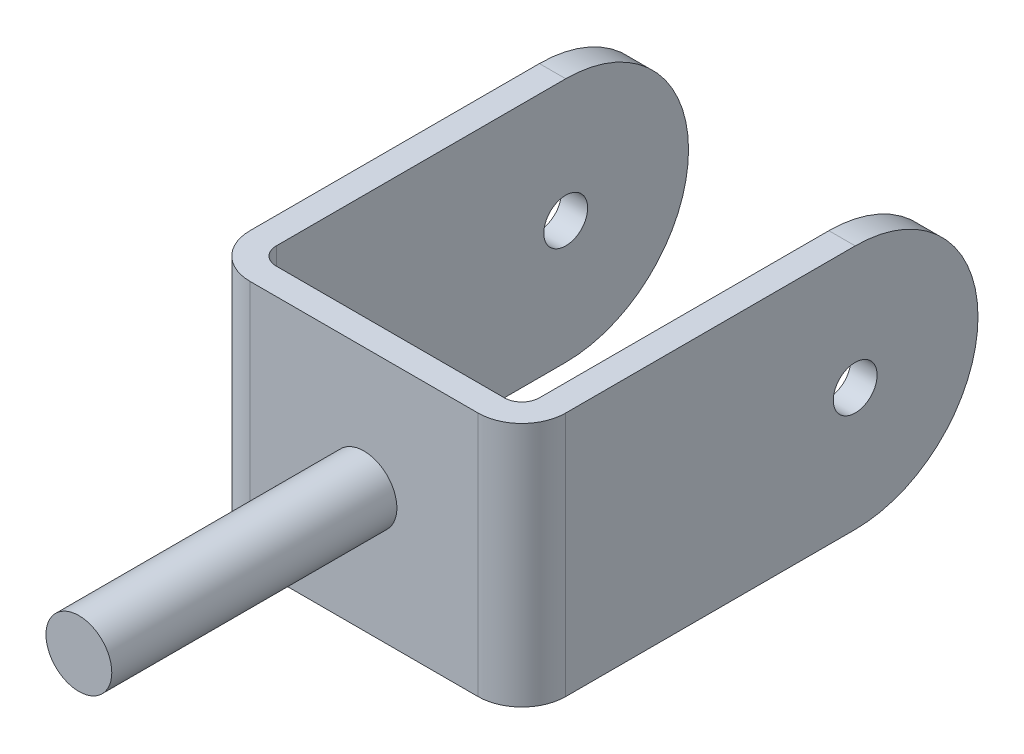
ISO-10303-21;
HEADER;
FILE_DESCRIPTION(('STEP AP214'),'2;1');
FILE_NAME('part.step','',(''),(''),'','','');
FILE_SCHEMA(('AUTOMOTIVE_DESIGN { 1 0 10303 214 1 1 1 1 }'));
ENDSEC;
DATA;
#1=APPLICATION_CONTEXT('core data for automotive mechanical design processes');
#2=APPLICATION_PROTOCOL_DEFINITION('international standard','automotive_design',2000,#1);
#3=PRODUCT_CONTEXT('',#1,'mechanical');
#4=PRODUCT('Part','Part','',(#3));
#5=PRODUCT_RELATED_PRODUCT_CATEGORY('part','',(#4));
#6=PRODUCT_DEFINITION_FORMATION('','',#4);
#7=PRODUCT_DEFINITION_CONTEXT('part definition',#1,'design');
#8=PRODUCT_DEFINITION('design','',#6,#7);
#9=PRODUCT_DEFINITION_SHAPE('','',#8);
#10=(LENGTH_UNIT() NAMED_UNIT(*) SI_UNIT(.MILLI.,.METRE.));
#11=(NAMED_UNIT(*) PLANE_ANGLE_UNIT() SI_UNIT($,.RADIAN.));
#12=(NAMED_UNIT(*) SI_UNIT($,.STERADIAN.) SOLID_ANGLE_UNIT());
#13=UNCERTAINTY_MEASURE_WITH_UNIT(LENGTH_MEASURE(1.E-05),#10,'distance_accuracy_value','');
#14=(GEOMETRIC_REPRESENTATION_CONTEXT(3) GLOBAL_UNCERTAINTY_ASSIGNED_CONTEXT((#13)) GLOBAL_UNIT_ASSIGNED_CONTEXT((#10,
#11,#12)) REPRESENTATION_CONTEXT('',''));
#15=CARTESIAN_POINT('',(0.,0.,0.));
#16=DIRECTION('',(0.,0.,1.));
#17=DIRECTION('',(1.,0.,0.));
#18=AXIS2_PLACEMENT_3D('',#15,#16,#17);
#19=CARTESIAN_POINT('',(-180.,280.,-50.0000000000004));
#20=DIRECTION('',(1.,0.,0.));
#21=DIRECTION('',(0.,0.,-1.));
#22=AXIS2_PLACEMENT_3D('',#19,#20,#21);
#23=PLANE('',#22);
#24=CARTESIAN_POINT('',(-180.,140.,-380.));
#25=DIRECTION('',(1.,0.,0.));
#26=DIRECTION('',(0.,0.,-1.));
#27=AXIS2_PLACEMENT_3D('',#24,#25,#26);
#28=CIRCLE('',#27,25.);
#29=CARTESIAN_POINT('',(-180.,140.,-405.));
#30=VERTEX_POINT('',#29);
#31=EDGE_CURVE('E249',#30,#30,#28,.T.);
#32=ORIENTED_EDGE('',*,*,#31,.T.);
#33=EDGE_LOOP('',(#32));
#34=FACE_BOUND('',#33,.T.);
#35=CARTESIAN_POINT('',(-180.,140.,-380.));
#36=DIRECTION('',(1.,0.,0.));
#37=DIRECTION('',(0.,0.,-1.));
#38=AXIS2_PLACEMENT_3D('',#35,#36,#37);
#39=CIRCLE('',#38,140.);
#40=CARTESIAN_POINT('',(-180.,0.,-380.));
#41=VERTEX_POINT('',#40);
#42=CARTESIAN_POINT('',(-180.,280.,-380.));
#43=VERTEX_POINT('',#42);
#44=EDGE_CURVE('E103',#41,#43,#39,.T.);
#45=ORIENTED_EDGE('',*,*,#44,.F.);
#46=DIRECTION('',(0.,0.,1.));
#47=VECTOR('',#46,1.);
#48=CARTESIAN_POINT('',(-180.,0.,-50.0000000000004));
#49=LINE('',#48,#47);
#50=CARTESIAN_POINT('',(-180.,0.,-50.0000000000004));
#51=VERTEX_POINT('',#50);
#52=EDGE_CURVE('E170',#41,#51,#49,.T.);
#53=ORIENTED_EDGE('',*,*,#52,.T.);
#54=DIRECTION('',(0.,-1.,0.));
#55=VECTOR('',#54,1.);
#56=CARTESIAN_POINT('',(-180.,280.,-50.0000000000004));
#57=LINE('',#56,#55);
#58=CARTESIAN_POINT('',(-180.,280.,-50.0000000000004));
#59=VERTEX_POINT('',#58);
#60=EDGE_CURVE('E237',#59,#51,#57,.T.);
#61=ORIENTED_EDGE('',*,*,#60,.F.);
#62=DIRECTION('',(0.,0.,1.));
#63=VECTOR('',#62,1.);
#64=CARTESIAN_POINT('',(-180.,280.,-50.0000000000004));
#65=LINE('',#64,#63);
#66=EDGE_CURVE('E172',#43,#59,#65,.T.);
#67=ORIENTED_EDGE('',*,*,#66,.F.);
#68=EDGE_LOOP('',(#45,#53,#61,#67));
#69=FACE_BOUND('',#68,.T.);
#70=ADVANCED_FACE('F81',(#34,#69),#23,.F.);
#71=CARTESIAN_POINT('',(180.,280.,-50.0000000000004));
#72=DIRECTION('',(-1.,0.,0.));
#73=DIRECTION('',(0.,0.,1.));
#74=AXIS2_PLACEMENT_3D('',#71,#72,#73);
#75=PLANE('',#74);
#76=CARTESIAN_POINT('',(180.,140.,-380.));
#77=DIRECTION('',(1.,0.,0.));
#78=DIRECTION('',(0.,0.,-1.));
#79=AXIS2_PLACEMENT_3D('',#76,#77,#78);
#80=CIRCLE('',#79,25.);
#81=CARTESIAN_POINT('',(180.,140.,-405.));
#82=VERTEX_POINT('',#81);
#83=EDGE_CURVE('E303',#82,#82,#80,.T.);
#84=ORIENTED_EDGE('',*,*,#83,.F.);
#85=EDGE_LOOP('',(#84));
#86=FACE_BOUND('',#85,.T.);
#87=DIRECTION('',(0.,0.,-1.));
#88=VECTOR('',#87,1.);
#89=CARTESIAN_POINT('',(180.,0.,-50.0000000000004));
#90=LINE('',#89,#88);
#91=CARTESIAN_POINT('',(180.,0.,-50.0000000000004));
#92=VERTEX_POINT('',#91);
#93=CARTESIAN_POINT('',(180.,0.,-380.));
#94=VERTEX_POINT('',#93);
#95=EDGE_CURVE('E203',#92,#94,#90,.T.);
#96=ORIENTED_EDGE('',*,*,#95,.T.);
#97=CARTESIAN_POINT('',(180.,140.,-380.));
#98=DIRECTION('',(1.,0.,0.));
#99=DIRECTION('',(0.,0.,-1.));
#100=AXIS2_PLACEMENT_3D('',#97,#98,#99);
#101=CIRCLE('',#100,140.);
#102=CARTESIAN_POINT('',(180.,280.,-380.));
#103=VERTEX_POINT('',#102);
#104=EDGE_CURVE('E174',#94,#103,#101,.T.);
#105=ORIENTED_EDGE('',*,*,#104,.T.);
#106=DIRECTION('',(0.,0.,-1.));
#107=VECTOR('',#106,1.);
#108=CARTESIAN_POINT('',(180.,280.,-50.0000000000004));
#109=LINE('',#108,#107);
#110=CARTESIAN_POINT('',(180.,280.,-50.0000000000004));
#111=VERTEX_POINT('',#110);
#112=EDGE_CURVE('E260',#111,#103,#109,.T.);
#113=ORIENTED_EDGE('',*,*,#112,.F.);
#114=DIRECTION('',(0.,-1.,0.));
#115=VECTOR('',#114,1.);
#116=CARTESIAN_POINT('',(180.,280.,-50.0000000000004));
#117=LINE('',#116,#115);
#118=EDGE_CURVE('E228',#111,#92,#117,.T.);
#119=ORIENTED_EDGE('',*,*,#118,.T.);
#120=EDGE_LOOP('',(#96,#105,#113,#119));
#121=FACE_BOUND('',#120,.T.);
#122=ADVANCED_FACE('F311',(#86,#121),#75,.F.);
#123=CARTESIAN_POINT('',(150.,280.,-50.0000000000004));
#124=DIRECTION('',(1.,0.,0.));
#125=DIRECTION('',(0.,0.,-1.));
#126=AXIS2_PLACEMENT_3D('',#123,#124,#125);
#127=PLANE('',#126);
#128=CARTESIAN_POINT('',(150.,140.,-380.));
#129=DIRECTION('',(1.,0.,0.));
#130=DIRECTION('',(0.,0.,-1.));
#131=AXIS2_PLACEMENT_3D('',#128,#129,#130);
#132=CIRCLE('',#131,25.);
#133=CARTESIAN_POINT('',(150.,140.,-405.));
#134=VERTEX_POINT('',#133);
#135=EDGE_CURVE('E194',#134,#134,#132,.T.);
#136=ORIENTED_EDGE('',*,*,#135,.T.);
#137=EDGE_LOOP('',(#136));
#138=FACE_BOUND('',#137,.T.);
#139=CARTESIAN_POINT('',(150.,140.,-380.));
#140=DIRECTION('',(1.,0.,0.));
#141=DIRECTION('',(0.,0.,-1.));
#142=AXIS2_PLACEMENT_3D('',#139,#140,#141);
#143=CIRCLE('',#142,140.);
#144=CARTESIAN_POINT('',(150.,0.,-380.));
#145=VERTEX_POINT('',#144);
#146=CARTESIAN_POINT('',(150.,280.,-380.));
#147=VERTEX_POINT('',#146);
#148=EDGE_CURVE('E95',#145,#147,#143,.T.);
#149=ORIENTED_EDGE('',*,*,#148,.F.);
#150=DIRECTION('',(0.,0.,1.));
#151=VECTOR('',#150,1.);
#152=CARTESIAN_POINT('',(150.,0.,-50.0000000000004));
#153=LINE('',#152,#151);
#154=CARTESIAN_POINT('',(150.,0.,-50.0000000000004));
#155=VERTEX_POINT('',#154);
#156=EDGE_CURVE('E206',#145,#155,#153,.T.);
#157=ORIENTED_EDGE('',*,*,#156,.T.);
#158=DIRECTION('',(0.,-1.,0.));
#159=VECTOR('',#158,1.);
#160=CARTESIAN_POINT('',(150.,280.,-50.0000000000004));
#161=LINE('',#160,#159);
#162=CARTESIAN_POINT('',(150.,280.,-50.0000000000004));
#163=VERTEX_POINT('',#162);
#164=EDGE_CURVE('E225',#163,#155,#161,.T.);
#165=ORIENTED_EDGE('',*,*,#164,.F.);
#166=DIRECTION('',(0.,0.,1.));
#167=VECTOR('',#166,1.);
#168=CARTESIAN_POINT('',(150.,280.,-50.0000000000004));
#169=LINE('',#168,#167);
#170=EDGE_CURVE('E263',#147,#163,#169,.T.);
#171=ORIENTED_EDGE('',*,*,#170,.F.);
#172=EDGE_LOOP('',(#149,#157,#165,#171));
#173=FACE_BOUND('',#172,.T.);
#174=ADVANCED_FACE('F294',(#138,#173),#127,.F.);
#175=CARTESIAN_POINT('',(-150.,280.,-50.0000000000002));
#176=DIRECTION('',(-1.,0.,0.));
#177=DIRECTION('',(0.,0.,1.));
#178=AXIS2_PLACEMENT_3D('',#175,#176,#177);
#179=PLANE('',#178);
#180=CARTESIAN_POINT('',(-150.,140.,-380.));
#181=DIRECTION('',(-1.,0.,0.));
#182=DIRECTION('',(0.,0.,1.));
#183=AXIS2_PLACEMENT_3D('',#180,#181,#182);
#184=CIRCLE('',#183,25.);
#185=CARTESIAN_POINT('',(-150.,140.,-355.));
#186=VERTEX_POINT('',#185);
#187=EDGE_CURVE('E242',#186,#186,#184,.T.);
#188=ORIENTED_EDGE('',*,*,#187,.T.);
#189=EDGE_LOOP('',(#188));
#190=FACE_BOUND('',#189,.T.);
#191=DIRECTION('',(0.,0.,-1.));
#192=VECTOR('',#191,1.);
#193=CARTESIAN_POINT('',(-150.,0.,-50.0000000000002));
#194=LINE('',#193,#192);
#195=CARTESIAN_POINT('',(-150.,0.,-50.0000000000002));
#196=VERTEX_POINT('',#195);
#197=CARTESIAN_POINT('',(-150.,0.,-380.));
#198=VERTEX_POINT('',#197);
#199=EDGE_CURVE('E214',#196,#198,#194,.T.);
#200=ORIENTED_EDGE('',*,*,#199,.T.);
#201=CARTESIAN_POINT('',(-150.,140.,-380.));
#202=DIRECTION('',(-1.,0.,0.));
#203=DIRECTION('',(0.,0.,1.));
#204=AXIS2_PLACEMENT_3D('',#201,#202,#203);
#205=CIRCLE('',#204,140.);
#206=CARTESIAN_POINT('',(-150.,280.,-380.));
#207=VERTEX_POINT('',#206);
#208=EDGE_CURVE('E180',#207,#198,#205,.T.);
#209=ORIENTED_EDGE('',*,*,#208,.F.);
#210=DIRECTION('',(0.,0.,-1.));
#211=VECTOR('',#210,1.);
#212=CARTESIAN_POINT('',(-150.,280.,-50.0000000000002));
#213=LINE('',#212,#211);
#214=CARTESIAN_POINT('',(-150.,280.,-50.0000000000002));
#215=VERTEX_POINT('',#214);
#216=EDGE_CURVE('E197',#215,#207,#213,.T.);
#217=ORIENTED_EDGE('',*,*,#216,.F.);
#218=DIRECTION('',(0.,-1.,0.));
#219=VECTOR('',#218,1.);
#220=CARTESIAN_POINT('',(-150.,280.,-50.0000000000002));
#221=LINE('',#220,#219);
#222=EDGE_CURVE('E216',#215,#196,#221,.T.);
#223=ORIENTED_EDGE('',*,*,#222,.T.);
#224=EDGE_LOOP('',(#200,#209,#217,#223));
#225=FACE_BOUND('',#224,.T.);
#226=ADVANCED_FACE('F276',(#190,#225),#179,.F.);
#227=CARTESIAN_POINT('',(-130.,0.,-50.));
#228=DIRECTION('',(0.,-1.,0.));
#229=DIRECTION('',(0.,0.,-1.));
#230=AXIS2_PLACEMENT_3D('',#227,#228,#229);
#231=PLANE('',#230);
#232=ORIENTED_EDGE('',*,*,#52,.F.);
#233=DIRECTION('',(1.,0.,0.));
#234=VECTOR('',#233,1.);
#235=CARTESIAN_POINT('',(-180.,0.,-380.));
#236=LINE('',#235,#234);
#237=EDGE_CURVE('E177',#41,#198,#236,.T.);
#238=ORIENTED_EDGE('',*,*,#237,.T.);
#239=ORIENTED_EDGE('',*,*,#199,.F.);
#240=CARTESIAN_POINT('',(-130.,0.,-50.));
#241=DIRECTION('',(0.,-1.,0.));
#242=DIRECTION('',(0.,0.,-1.));
#243=AXIS2_PLACEMENT_3D('',#240,#241,#242);
#244=CIRCLE('',#243,20.);
#245=CARTESIAN_POINT('',(-130.,0.,-30.));
#246=VERTEX_POINT('',#245);
#247=EDGE_CURVE('E212',#246,#196,#244,.T.);
#248=ORIENTED_EDGE('',*,*,#247,.F.);
#249=DIRECTION('',(-1.,0.,0.));
#250=VECTOR('',#249,1.);
#251=CARTESIAN_POINT('',(-130.,0.,-30.));
#252=LINE('',#251,#250);
#253=CARTESIAN_POINT('',(130.,0.,-30.));
#254=VERTEX_POINT('',#253);
#255=EDGE_CURVE('E210',#254,#246,#252,.T.);
#256=ORIENTED_EDGE('',*,*,#255,.F.);
#257=CARTESIAN_POINT('',(130.,0.,-50.));
#258=DIRECTION('',(0.,-1.,0.));
#259=DIRECTION('',(0.,0.,1.));
#260=AXIS2_PLACEMENT_3D('',#257,#258,#259);
#261=CIRCLE('',#260,20.);
#262=EDGE_CURVE('E208',#155,#254,#261,.T.);
#263=ORIENTED_EDGE('',*,*,#262,.F.);
#264=ORIENTED_EDGE('',*,*,#156,.F.);
#265=DIRECTION('',(1.,0.,0.));
#266=VECTOR('',#265,1.);
#267=CARTESIAN_POINT('',(-180.,0.,-380.));
#268=LINE('',#267,#266);
#269=EDGE_CURVE('E12',#145,#94,#268,.T.);
#270=ORIENTED_EDGE('',*,*,#269,.T.);
#271=ORIENTED_EDGE('',*,*,#95,.F.);
#272=CARTESIAN_POINT('',(130.,0.,-50.));
#273=DIRECTION('',(0.,1.,0.));
#274=DIRECTION('',(0.,0.,1.));
#275=AXIS2_PLACEMENT_3D('',#272,#273,#274);
#276=CIRCLE('',#275,50.);
#277=CARTESIAN_POINT('',(130.,0.,0.));
#278=VERTEX_POINT('',#277);
#279=EDGE_CURVE('E201',#278,#92,#276,.T.);
#280=ORIENTED_EDGE('',*,*,#279,.F.);
#281=DIRECTION('',(1.,0.,0.));
#282=VECTOR('',#281,1.);
#283=CARTESIAN_POINT('',(-130.,0.,0.));
#284=LINE('',#283,#282);
#285=CARTESIAN_POINT('',(-130.,0.,0.));
#286=VERTEX_POINT('',#285);
#287=EDGE_CURVE('E191',#286,#278,#284,.T.);
#288=ORIENTED_EDGE('',*,*,#287,.F.);
#289=CARTESIAN_POINT('',(-130.,0.,-50.));
#290=DIRECTION('',(0.,1.,0.));
#291=DIRECTION('',(0.,0.,-1.));
#292=AXIS2_PLACEMENT_3D('',#289,#290,#291);
#293=CIRCLE('',#292,50.);
#294=EDGE_CURVE('E188',#51,#286,#293,.T.);
#295=ORIENTED_EDGE('',*,*,#294,.F.);
#296=EDGE_LOOP('',(#232,#238,#239,#248,#256,#263,#264,#270,#271,#280,#288,#295));
#297=FACE_BOUND('',#296,.T.);
#298=ADVANCED_FACE('F186',(#297),#231,.T.);
#299=CARTESIAN_POINT('',(-130.,280.,-50.));
#300=DIRECTION('',(0.,-1.,0.));
#301=DIRECTION('',(0.,0.,-1.));
#302=AXIS2_PLACEMENT_3D('',#299,#300,#301);
#303=PLANE('',#302);
#304=DIRECTION('',(1.,0.,0.));
#305=VECTOR('',#304,1.);
#306=CARTESIAN_POINT('',(-180.,280.,-380.));
#307=LINE('',#306,#305);
#308=EDGE_CURVE('E173',#43,#207,#307,.T.);
#309=ORIENTED_EDGE('',*,*,#308,.F.);
#310=ORIENTED_EDGE('',*,*,#66,.T.);
#311=CARTESIAN_POINT('',(-130.,280.,-50.));
#312=DIRECTION('',(0.,1.,0.));
#313=DIRECTION('',(0.,0.,-1.));
#314=AXIS2_PLACEMENT_3D('',#311,#312,#313);
#315=CIRCLE('',#314,50.);
#316=CARTESIAN_POINT('',(-130.,280.,0.));
#317=VERTEX_POINT('',#316);
#318=EDGE_CURVE('E254',#59,#317,#315,.T.);
#319=ORIENTED_EDGE('',*,*,#318,.T.);
#320=DIRECTION('',(1.,0.,0.));
#321=VECTOR('',#320,1.);
#322=CARTESIAN_POINT('',(-130.,280.,0.));
#323=LINE('',#322,#321);
#324=CARTESIAN_POINT('',(130.,280.,0.));
#325=VERTEX_POINT('',#324);
#326=EDGE_CURVE('E256',#317,#325,#323,.T.);
#327=ORIENTED_EDGE('',*,*,#326,.T.);
#328=CARTESIAN_POINT('',(130.,280.,-50.));
#329=DIRECTION('',(0.,1.,0.));
#330=DIRECTION('',(0.,0.,1.));
#331=AXIS2_PLACEMENT_3D('',#328,#329,#330);
#332=CIRCLE('',#331,50.);
#333=EDGE_CURVE('E258',#325,#111,#332,.T.);
#334=ORIENTED_EDGE('',*,*,#333,.T.);
#335=ORIENTED_EDGE('',*,*,#112,.T.);
#336=DIRECTION('',(1.,0.,0.));
#337=VECTOR('',#336,1.);
#338=CARTESIAN_POINT('',(-180.,280.,-380.));
#339=LINE('',#338,#337);
#340=EDGE_CURVE('E88',#147,#103,#339,.T.);
#341=ORIENTED_EDGE('',*,*,#340,.F.);
#342=ORIENTED_EDGE('',*,*,#170,.T.);
#343=CARTESIAN_POINT('',(130.,280.,-50.));
#344=DIRECTION('',(0.,-1.,0.));
#345=DIRECTION('',(0.,0.,1.));
#346=AXIS2_PLACEMENT_3D('',#343,#344,#345);
#347=CIRCLE('',#346,20.);
#348=CARTESIAN_POINT('',(130.,280.,-30.));
#349=VERTEX_POINT('',#348);
#350=EDGE_CURVE('E265',#163,#349,#347,.T.);
#351=ORIENTED_EDGE('',*,*,#350,.T.);
#352=DIRECTION('',(-1.,0.,0.));
#353=VECTOR('',#352,1.);
#354=CARTESIAN_POINT('',(-130.,280.,-30.));
#355=LINE('',#354,#353);
#356=CARTESIAN_POINT('',(-130.,280.,-30.));
#357=VERTEX_POINT('',#356);
#358=EDGE_CURVE('E267',#349,#357,#355,.T.);
#359=ORIENTED_EDGE('',*,*,#358,.T.);
#360=CARTESIAN_POINT('',(-130.,280.,-50.));
#361=DIRECTION('',(0.,-1.,0.));
#362=DIRECTION('',(0.,0.,-1.));
#363=AXIS2_PLACEMENT_3D('',#360,#361,#362);
#364=CIRCLE('',#363,20.);
#365=EDGE_CURVE('E268',#357,#215,#364,.T.);
#366=ORIENTED_EDGE('',*,*,#365,.T.);
#367=ORIENTED_EDGE('',*,*,#216,.T.);
#368=EDGE_LOOP('',(#309,#310,#319,#327,#334,#335,#341,#342,#351,#359,#366,#367));
#369=FACE_BOUND('',#368,.T.);
#370=ADVANCED_FACE('F274',(#369),#303,.F.);
#371=CARTESIAN_POINT('',(-130.,280.,-50.));
#372=DIRECTION('',(0.,-1.,0.));
#373=DIRECTION('',(0.,0.,-1.));
#374=AXIS2_PLACEMENT_3D('',#371,#372,#373);
#375=CYLINDRICAL_SURFACE('',#374,50.);
#376=ORIENTED_EDGE('',*,*,#294,.T.);
#377=DIRECTION('',(0.,-1.,0.));
#378=VECTOR('',#377,1.);
#379=CARTESIAN_POINT('',(-130.,280.,0.));
#380=LINE('',#379,#378);
#381=EDGE_CURVE('E234',#317,#286,#380,.T.);
#382=ORIENTED_EDGE('',*,*,#381,.F.);
#383=ORIENTED_EDGE('',*,*,#318,.F.);
#384=ORIENTED_EDGE('',*,*,#60,.T.);
#385=EDGE_LOOP('',(#376,#382,#383,#384));
#386=FACE_BOUND('',#385,.T.);
#387=ADVANCED_FACE('F326',(#386),#375,.T.);
#388=CARTESIAN_POINT('',(-130.,280.,0.));
#389=DIRECTION('',(0.,0.,-1.));
#390=DIRECTION('',(-1.,0.,0.));
#391=AXIS2_PLACEMENT_3D('',#388,#389,#390);
#392=PLANE('',#391);
#393=CARTESIAN_POINT('',(0.,140.,0.));
#394=DIRECTION('',(0.,0.,-1.));
#395=DIRECTION('',(-1.,0.,0.));
#396=AXIS2_PLACEMENT_3D('',#393,#394,#395);
#397=CIRCLE('',#396,37.5);
#398=CARTESIAN_POINT('',(-37.5,140.,0.));
#399=VERTEX_POINT('',#398);
#400=EDGE_CURVE('E239',#399,#399,#397,.F.);
#401=ORIENTED_EDGE('',*,*,#400,.F.);
#402=EDGE_LOOP('',(#401));
#403=FACE_BOUND('',#402,.T.);
#404=ORIENTED_EDGE('',*,*,#287,.T.);
#405=DIRECTION('',(0.,-1.,0.));
#406=VECTOR('',#405,1.);
#407=CARTESIAN_POINT('',(130.,280.,0.));
#408=LINE('',#407,#406);
#409=EDGE_CURVE('E231',#325,#278,#408,.T.);
#410=ORIENTED_EDGE('',*,*,#409,.F.);
#411=ORIENTED_EDGE('',*,*,#326,.F.);
#412=ORIENTED_EDGE('',*,*,#381,.T.);
#413=EDGE_LOOP('',(#404,#410,#411,#412));
#414=FACE_BOUND('',#413,.T.);
#415=ADVANCED_FACE('F322',(#403,#414),#392,.F.);
#416=CARTESIAN_POINT('',(130.,280.,-50.));
#417=DIRECTION('',(0.,-1.,0.));
#418=DIRECTION('',(0.,0.,-1.));
#419=AXIS2_PLACEMENT_3D('',#416,#417,#418);
#420=CYLINDRICAL_SURFACE('',#419,50.);
#421=ORIENTED_EDGE('',*,*,#279,.T.);
#422=ORIENTED_EDGE('',*,*,#118,.F.);
#423=ORIENTED_EDGE('',*,*,#333,.F.);
#424=ORIENTED_EDGE('',*,*,#409,.T.);
#425=EDGE_LOOP('',(#421,#422,#423,#424));
#426=FACE_BOUND('',#425,.T.);
#427=ADVANCED_FACE('F317',(#426),#420,.T.);
#428=CARTESIAN_POINT('',(130.,280.,-50.));
#429=DIRECTION('',(0.,-1.,0.));
#430=DIRECTION('',(0.,0.,-1.));
#431=AXIS2_PLACEMENT_3D('',#428,#429,#430);
#432=CYLINDRICAL_SURFACE('',#431,20.);
#433=ORIENTED_EDGE('',*,*,#262,.T.);
#434=DIRECTION('',(0.,-1.,0.));
#435=VECTOR('',#434,1.);
#436=CARTESIAN_POINT('',(130.,280.,-30.));
#437=LINE('',#436,#435);
#438=EDGE_CURVE('E222',#349,#254,#437,.T.);
#439=ORIENTED_EDGE('',*,*,#438,.F.);
#440=ORIENTED_EDGE('',*,*,#350,.F.);
#441=ORIENTED_EDGE('',*,*,#164,.T.);
#442=EDGE_LOOP('',(#433,#439,#440,#441));
#443=FACE_BOUND('',#442,.T.);
#444=ADVANCED_FACE('F289',(#443),#432,.F.);
#445=CARTESIAN_POINT('',(-130.,280.,-30.));
#446=DIRECTION('',(0.,0.,1.));
#447=DIRECTION('',(1.,0.,0.));
#448=AXIS2_PLACEMENT_3D('',#445,#446,#447);
#449=PLANE('',#448);
#450=ORIENTED_EDGE('',*,*,#255,.T.);
#451=DIRECTION('',(0.,-1.,0.));
#452=VECTOR('',#451,1.);
#453=CARTESIAN_POINT('',(-130.,280.,-30.));
#454=LINE('',#453,#452);
#455=EDGE_CURVE('E219',#357,#246,#454,.T.);
#456=ORIENTED_EDGE('',*,*,#455,.F.);
#457=ORIENTED_EDGE('',*,*,#358,.F.);
#458=ORIENTED_EDGE('',*,*,#438,.T.);
#459=EDGE_LOOP('',(#450,#456,#457,#458));
#460=FACE_BOUND('',#459,.T.);
#461=ADVANCED_FACE('F285',(#460),#449,.F.);
#462=CARTESIAN_POINT('',(-130.,280.,-50.));
#463=DIRECTION('',(0.,-1.,0.));
#464=DIRECTION('',(0.,0.,-1.));
#465=AXIS2_PLACEMENT_3D('',#462,#463,#464);
#466=CYLINDRICAL_SURFACE('',#465,20.);
#467=ORIENTED_EDGE('',*,*,#247,.T.);
#468=ORIENTED_EDGE('',*,*,#222,.F.);
#469=ORIENTED_EDGE('',*,*,#365,.F.);
#470=ORIENTED_EDGE('',*,*,#455,.T.);
#471=EDGE_LOOP('',(#467,#468,#469,#470));
#472=FACE_BOUND('',#471,.T.);
#473=ADVANCED_FACE('F281',(#472),#466,.F.);
#474=CARTESIAN_POINT('',(0.,140.,325.));
#475=DIRECTION('',(0.,0.,-1.));
#476=DIRECTION('',(-1.,0.,0.));
#477=AXIS2_PLACEMENT_3D('',#474,#475,#476);
#478=CYLINDRICAL_SURFACE('',#477,37.5);
#479=CARTESIAN_POINT('',(0.,140.,325.));
#480=DIRECTION('',(0.,0.,1.));
#481=DIRECTION('',(1.,0.,0.));
#482=AXIS2_PLACEMENT_3D('',#479,#480,#481);
#483=CIRCLE('',#482,37.5);
#484=CARTESIAN_POINT('',(37.5,140.,325.));
#485=VERTEX_POINT('',#484);
#486=EDGE_CURVE('E189',#485,#485,#483,.T.);
#487=ORIENTED_EDGE('',*,*,#486,.F.);
#488=EDGE_LOOP('',(#487));
#489=FACE_BOUND('',#488,.T.);
#490=ORIENTED_EDGE('',*,*,#400,.T.);
#491=EDGE_LOOP('',(#490));
#492=FACE_BOUND('',#491,.T.);
#493=ADVANCED_FACE('F354',(#489,#492),#478,.T.);
#494=CARTESIAN_POINT('',(0.,140.,325.));
#495=DIRECTION('',(0.,0.,1.));
#496=DIRECTION('',(1.,0.,0.));
#497=AXIS2_PLACEMENT_3D('',#494,#495,#496);
#498=PLANE('',#497);
#499=ORIENTED_EDGE('',*,*,#486,.T.);
#500=EDGE_LOOP('',(#499));
#501=FACE_BOUND('',#500,.T.);
#502=ADVANCED_FACE('F351',(#501),#498,.T.);
#503=CARTESIAN_POINT('',(-180.,140.,-380.));
#504=DIRECTION('',(1.,0.,0.));
#505=DIRECTION('',(0.,0.,-1.));
#506=AXIS2_PLACEMENT_3D('',#503,#504,#505);
#507=CYLINDRICAL_SURFACE('',#506,140.);
#508=ORIENTED_EDGE('',*,*,#148,.T.);
#509=ORIENTED_EDGE('',*,*,#340,.T.);
#510=ORIENTED_EDGE('',*,*,#104,.F.);
#511=ORIENTED_EDGE('',*,*,#269,.F.);
#512=EDGE_LOOP('',(#508,#509,#510,#511));
#513=FACE_BOUND('',#512,.T.);
#514=ADVANCED_FACE('F296',(#513),#507,.T.);
#515=ORIENTED_EDGE('',*,*,#208,.T.);
#516=ORIENTED_EDGE('',*,*,#237,.F.);
#517=ORIENTED_EDGE('',*,*,#44,.T.);
#518=ORIENTED_EDGE('',*,*,#308,.T.);
#519=EDGE_LOOP('',(#515,#516,#517,#518));
#520=FACE_BOUND('',#519,.T.);
#521=ADVANCED_FACE('F178',(#520),#507,.T.);
#522=CARTESIAN_POINT('',(-180.,140.,-380.));
#523=DIRECTION('',(1.,0.,0.));
#524=DIRECTION('',(0.,0.,-1.));
#525=AXIS2_PLACEMENT_3D('',#522,#523,#524);
#526=CYLINDRICAL_SURFACE('',#525,25.);
#527=ORIENTED_EDGE('',*,*,#31,.F.);
#528=EDGE_LOOP('',(#527));
#529=FACE_BOUND('',#528,.T.);
#530=ORIENTED_EDGE('',*,*,#187,.F.);
#531=EDGE_LOOP('',(#530));
#532=FACE_BOUND('',#531,.T.);
#533=ADVANCED_FACE('F341',(#529,#532),#526,.F.);
#534=ORIENTED_EDGE('',*,*,#83,.T.);
#535=EDGE_LOOP('',(#534));
#536=FACE_BOUND('',#535,.T.);
#537=ORIENTED_EDGE('',*,*,#135,.F.);
#538=EDGE_LOOP('',(#537));
#539=FACE_BOUND('',#538,.T.);
#540=ADVANCED_FACE('F308',(#536,#539),#526,.F.);
#541=CLOSED_SHELL('',(#70,#122,#174,#226,#298,#370,#387,#415,#427,#444,#461,#473,#493,#502,#514,
#521,#533,#540));
#542=MANIFOLD_SOLID_BREP('B2',#541);
#543=ADVANCED_BREP_SHAPE_REPRESENTATION('',(#18,#542),#14);
#544=SHAPE_DEFINITION_REPRESENTATION(#9,#543);
ENDSEC;
END-ISO-10303-21;
